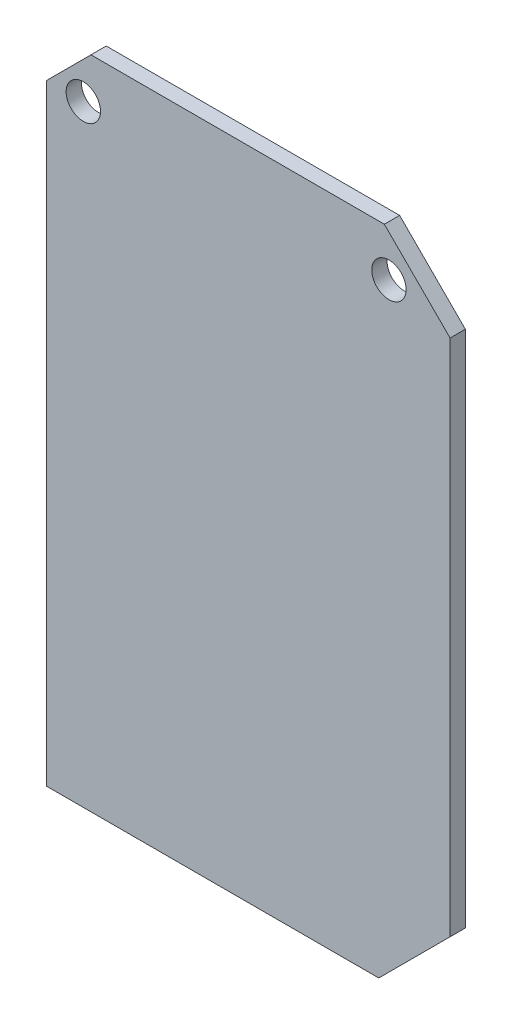
ISO-10303-21;
HEADER;
FILE_DESCRIPTION(('STEP AP214'),'2;1');
FILE_NAME('part.step','',(''),(''),'','','');
FILE_SCHEMA(('AUTOMOTIVE_DESIGN { 1 0 10303 214 1 1 1 1 }'));
ENDSEC;
DATA;
#1=APPLICATION_CONTEXT('core data for automotive mechanical design processes');
#2=APPLICATION_PROTOCOL_DEFINITION('international standard','automotive_design',2000,#1);
#3=PRODUCT_CONTEXT('',#1,'mechanical');
#4=PRODUCT('Part','Part','',(#3));
#5=PRODUCT_RELATED_PRODUCT_CATEGORY('part','',(#4));
#6=PRODUCT_DEFINITION_FORMATION('','',#4);
#7=PRODUCT_DEFINITION_CONTEXT('part definition',#1,'design');
#8=PRODUCT_DEFINITION('design','',#6,#7);
#9=PRODUCT_DEFINITION_SHAPE('','',#8);
#10=(LENGTH_UNIT() NAMED_UNIT(*) SI_UNIT(.MILLI.,.METRE.));
#11=(NAMED_UNIT(*) PLANE_ANGLE_UNIT() SI_UNIT($,.RADIAN.));
#12=(NAMED_UNIT(*) SI_UNIT($,.STERADIAN.) SOLID_ANGLE_UNIT());
#13=UNCERTAINTY_MEASURE_WITH_UNIT(LENGTH_MEASURE(1.E-05),#10,'distance_accuracy_value','');
#14=(GEOMETRIC_REPRESENTATION_CONTEXT(3) GLOBAL_UNCERTAINTY_ASSIGNED_CONTEXT((#13)) GLOBAL_UNIT_ASSIGNED_CONTEXT((#10,
#11,#12)) REPRESENTATION_CONTEXT('',''));
#15=CARTESIAN_POINT('',(0.,0.,0.));
#16=DIRECTION('',(0.,0.,1.));
#17=DIRECTION('',(1.,0.,0.));
#18=AXIS2_PLACEMENT_3D('',#15,#16,#17);
#19=CARTESIAN_POINT('',(4.868530469244,-3.958623226943,26.298881449435));
#20=DIRECTION('',(0.,0.,-1.));
#21=DIRECTION('',(0.,1.,0.));
#22=AXIS2_PLACEMENT_3D('',#19,#20,#21);
#23=PLANE('',#22);
#24=DIRECTION('',(-0.707106781186548,-0.707106781186548,0.));
#25=VECTOR('',#24,1.);
#26=CARTESIAN_POINT('',(31.268530469244,0.708281528888,26.298881449435));
#27=LINE('',#26,#25);
#28=CARTESIAN_POINT('',(26.601625713413,-3.958623226943,26.298881449435));
#29=VERTEX_POINT('',#28);
#30=CARTESIAN_POINT('',(31.268530469244,0.708281528888002,26.298881449435));
#31=VERTEX_POINT('',#30);
#32=EDGE_CURVE('E79',#29,#31,#27,.F.);
#33=ORIENTED_EDGE('',*,*,#32,.T.);
#34=DIRECTION('',(0.,-1.,0.));
#35=VECTOR('',#34,1.);
#36=CARTESIAN_POINT('',(31.268530469244,0.708281528888,26.298881449435));
#37=LINE('',#36,#35);
#38=CARTESIAN_POINT('',(31.268530469244,34.641376773057,26.298881449435));
#39=VERTEX_POINT('',#38);
#40=EDGE_CURVE('E109',#31,#39,#37,.F.);
#41=ORIENTED_EDGE('',*,*,#40,.T.);
#42=DIRECTION('',(0.707106781186548,-0.707106781186548,0.));
#43=VECTOR('',#42,1.);
#44=CARTESIAN_POINT('',(31.268530469244,34.641376773057,26.298881449435));
#45=LINE('',#44,#43);
#46=CARTESIAN_POINT('',(26.968530469244,38.941376773057,26.298881449435));
#47=VERTEX_POINT('',#46);
#48=EDGE_CURVE('E117',#39,#47,#45,.F.);
#49=ORIENTED_EDGE('',*,*,#48,.T.);
#50=DIRECTION('',(1.,0.,0.));
#51=VECTOR('',#50,1.);
#52=CARTESIAN_POINT('',(26.968530469244,38.941376773057,26.298881449435));
#53=LINE('',#52,#51);
#54=CARTESIAN_POINT('',(7.768530469244,38.941376773057,26.298881449435));
#55=VERTEX_POINT('',#54);
#56=EDGE_CURVE('E121',#47,#55,#53,.F.);
#57=ORIENTED_EDGE('',*,*,#56,.T.);
#58=DIRECTION('',(0.707106781186548,0.707106781186548,0.));
#59=VECTOR('',#58,1.);
#60=CARTESIAN_POINT('',(7.768530469244,38.941376773057,26.298881449435));
#61=LINE('',#60,#59);
#62=CARTESIAN_POINT('',(4.868530469244,36.041376773057,26.298881449435));
#63=VERTEX_POINT('',#62);
#64=EDGE_CURVE('E125',#55,#63,#61,.F.);
#65=ORIENTED_EDGE('',*,*,#64,.T.);
#66=DIRECTION('',(0.,1.,0.));
#67=VECTOR('',#66,1.);
#68=CARTESIAN_POINT('',(4.868530469244,36.041376773057,26.298881449435));
#69=LINE('',#68,#67);
#70=CARTESIAN_POINT('',(4.868530469244,-3.95862322694301,26.298881449435));
#71=VERTEX_POINT('',#70);
#72=EDGE_CURVE('E74',#63,#71,#69,.F.);
#73=ORIENTED_EDGE('',*,*,#72,.T.);
#74=DIRECTION('',(-1.,0.,0.));
#75=VECTOR('',#74,1.);
#76=CARTESIAN_POINT('',(26.601625713413,-3.958623226943,26.298881449435));
#77=LINE('',#76,#75);
#78=EDGE_CURVE('E76',#71,#29,#77,.F.);
#79=ORIENTED_EDGE('',*,*,#78,.T.);
#80=EDGE_LOOP('',(#33,#41,#49,#57,#65,#73,#79));
#81=FACE_BOUND('',#80,.T.);
#82=CARTESIAN_POINT('',(7.268530469244,36.041376773057,26.298881449435));
#83=DIRECTION('',(0.,0.,1.));
#84=DIRECTION('',(0.,-1.,0.));
#85=AXIS2_PLACEMENT_3D('',#82,#83,#84);
#86=CIRCLE('',#85,1.125);
#87=CARTESIAN_POINT('',(7.268530469244,34.916376773057,26.298881449435));
#88=VERTEX_POINT('',#87);
#89=EDGE_CURVE('E105',#88,#88,#86,.F.);
#90=ORIENTED_EDGE('',*,*,#89,.T.);
#91=EDGE_LOOP('',(#90));
#92=FACE_BOUND('',#91,.T.);
#93=CARTESIAN_POINT('',(27.268530469244,35.941376773057,26.298881449435));
#94=DIRECTION('',(0.,0.,1.));
#95=DIRECTION('',(0.,-1.,0.));
#96=AXIS2_PLACEMENT_3D('',#93,#94,#95);
#97=CIRCLE('',#96,1.125);
#98=CARTESIAN_POINT('',(27.268530469244,34.816376773057,26.298881449435));
#99=VERTEX_POINT('',#98);
#100=EDGE_CURVE('E20',#99,#99,#97,.F.);
#101=ORIENTED_EDGE('',*,*,#100,.T.);
#102=EDGE_LOOP('',(#101));
#103=FACE_BOUND('',#102,.T.);
#104=ADVANCED_FACE('F17',(#81,#92,#103),#23,.F.);
#105=CARTESIAN_POINT('',(27.268530469244,35.941376773057,25.298881449435));
#106=DIRECTION('',(0.,0.,1.));
#107=DIRECTION('',(0.,-1.,0.));
#108=AXIS2_PLACEMENT_3D('',#105,#106,#107);
#109=CYLINDRICAL_SURFACE('',#108,1.125);
#110=ORIENTED_EDGE('',*,*,#100,.F.);
#111=EDGE_LOOP('',(#110));
#112=FACE_BOUND('',#111,.T.);
#113=CARTESIAN_POINT('',(27.268530469244,35.941376773057,25.298881449435));
#114=DIRECTION('',(0.,0.,1.));
#115=DIRECTION('',(0.,-1.,0.));
#116=AXIS2_PLACEMENT_3D('',#113,#114,#115);
#117=CIRCLE('',#116,1.125);
#118=CARTESIAN_POINT('',(27.268530469244,34.816376773057,25.298881449435));
#119=VERTEX_POINT('',#118);
#120=EDGE_CURVE('E102',#119,#119,#117,.T.);
#121=ORIENTED_EDGE('',*,*,#120,.F.);
#122=EDGE_LOOP('',(#121));
#123=FACE_BOUND('',#122,.T.);
#124=ADVANCED_FACE('F239',(#112,#123),#109,.F.);
#125=CARTESIAN_POINT('',(31.268530469244,0.708281528888,25.298881449435));
#126=DIRECTION('',(-0.707106781186548,0.707106781186548,0.));
#127=DIRECTION('',(-0.707106781186548,-0.707106781186548,0.));
#128=AXIS2_PLACEMENT_3D('',#125,#126,#127);
#129=PLANE('',#128);
#130=DIRECTION('',(-0.707106781186548,-0.707106781186547,0.));
#131=VECTOR('',#130,1.);
#132=CARTESIAN_POINT('',(31.268530469244,0.708281528887999,25.298881449435));
#133=LINE('',#132,#131);
#134=CARTESIAN_POINT('',(31.268530469244,0.708281528888001,25.298881449435));
#135=VERTEX_POINT('',#134);
#136=CARTESIAN_POINT('',(26.601625713413,-3.958623226943,25.298881449435));
#137=VERTEX_POINT('',#136);
#138=EDGE_CURVE('E104',#135,#137,#133,.T.);
#139=ORIENTED_EDGE('',*,*,#138,.F.);
#140=DIRECTION('',(0.,0.,1.));
#141=VECTOR('',#140,1.);
#142=CARTESIAN_POINT('',(31.268530469244,0.708281528887999,25.298881449435));
#143=LINE('',#142,#141);
#144=EDGE_CURVE('E90',#135,#31,#143,.T.);
#145=ORIENTED_EDGE('',*,*,#144,.T.);
#146=ORIENTED_EDGE('',*,*,#32,.F.);
#147=DIRECTION('',(0.,0.,1.));
#148=VECTOR('',#147,1.);
#149=CARTESIAN_POINT('',(26.601625713413,-3.958623226943,25.298881449435));
#150=LINE('',#149,#148);
#151=EDGE_CURVE('E84',#29,#137,#150,.F.);
#152=ORIENTED_EDGE('',*,*,#151,.T.);
#153=EDGE_LOOP('',(#139,#145,#146,#152));
#154=FACE_BOUND('',#153,.T.);
#155=ADVANCED_FACE('F87',(#154),#129,.F.);
#156=CARTESIAN_POINT('',(26.601625713413,-3.958623226943,25.298881449435));
#157=DIRECTION('',(0.,1.,0.));
#158=DIRECTION('',(-1.,0.,0.));
#159=AXIS2_PLACEMENT_3D('',#156,#157,#158);
#160=PLANE('',#159);
#161=DIRECTION('',(1.,0.,0.));
#162=VECTOR('',#161,1.);
#163=CARTESIAN_POINT('',(4.868530469244,-3.958623226943,25.298881449435));
#164=LINE('',#163,#162);
#165=CARTESIAN_POINT('',(4.868530469244,-3.95862322694301,25.298881449435));
#166=VERTEX_POINT('',#165);
#167=EDGE_CURVE('E95',#137,#166,#164,.F.);
#168=ORIENTED_EDGE('',*,*,#167,.F.);
#169=ORIENTED_EDGE('',*,*,#151,.F.);
#170=ORIENTED_EDGE('',*,*,#78,.F.);
#171=DIRECTION('',(0.,0.,1.));
#172=VECTOR('',#171,1.);
#173=CARTESIAN_POINT('',(4.868530469244,-3.95862322694301,25.298881449435));
#174=LINE('',#173,#172);
#175=EDGE_CURVE('E98',#71,#166,#174,.F.);
#176=ORIENTED_EDGE('',*,*,#175,.T.);
#177=EDGE_LOOP('',(#168,#169,#170,#176));
#178=FACE_BOUND('',#177,.T.);
#179=ADVANCED_FACE('F93',(#178),#160,.F.);
#180=CARTESIAN_POINT('',(4.868530469244,36.041376773057,25.298881449435));
#181=DIRECTION('',(1.,0.,0.));
#182=DIRECTION('',(0.,1.,0.));
#183=AXIS2_PLACEMENT_3D('',#180,#181,#182);
#184=PLANE('',#183);
#185=DIRECTION('',(0.,1.,0.));
#186=VECTOR('',#185,1.);
#187=CARTESIAN_POINT('',(4.868530469244,-3.958623226943,25.298881449435));
#188=LINE('',#187,#186);
#189=CARTESIAN_POINT('',(4.868530469244,36.041376773057,25.298881449435));
#190=VERTEX_POINT('',#189);
#191=EDGE_CURVE('E129',#166,#190,#188,.T.);
#192=ORIENTED_EDGE('',*,*,#191,.F.);
#193=ORIENTED_EDGE('',*,*,#175,.F.);
#194=ORIENTED_EDGE('',*,*,#72,.F.);
#195=DIRECTION('',(0.,0.,1.));
#196=VECTOR('',#195,1.);
#197=CARTESIAN_POINT('',(4.868530469244,36.041376773057,25.298881449435));
#198=LINE('',#197,#196);
#199=EDGE_CURVE('E123',#63,#190,#198,.F.);
#200=ORIENTED_EDGE('',*,*,#199,.T.);
#201=EDGE_LOOP('',(#192,#193,#194,#200));
#202=FACE_BOUND('',#201,.T.);
#203=ADVANCED_FACE('F130',(#202),#184,.F.);
#204=CARTESIAN_POINT('',(7.768530469244,38.941376773057,25.298881449435));
#205=DIRECTION('',(0.707106781186548,-0.707106781186548,0.));
#206=DIRECTION('',(0.707106781186548,0.707106781186548,0.));
#207=AXIS2_PLACEMENT_3D('',#204,#205,#206);
#208=PLANE('',#207);
#209=DIRECTION('',(0.707106781186547,0.707106781186548,0.));
#210=VECTOR('',#209,1.);
#211=CARTESIAN_POINT('',(4.868530469244,36.041376773057,25.298881449435));
#212=LINE('',#211,#210);
#213=CARTESIAN_POINT('',(7.768530469244,38.941376773057,25.298881449435));
#214=VERTEX_POINT('',#213);
#215=EDGE_CURVE('E135',#190,#214,#212,.T.);
#216=ORIENTED_EDGE('',*,*,#215,.F.);
#217=ORIENTED_EDGE('',*,*,#199,.F.);
#218=ORIENTED_EDGE('',*,*,#64,.F.);
#219=DIRECTION('',(0.,0.,-1.));
#220=VECTOR('',#219,1.);
#221=CARTESIAN_POINT('',(7.768530469244,38.941376773057,25.298881449435));
#222=LINE('',#221,#220);
#223=EDGE_CURVE('E119',#55,#214,#222,.T.);
#224=ORIENTED_EDGE('',*,*,#223,.T.);
#225=EDGE_LOOP('',(#216,#217,#218,#224));
#226=FACE_BOUND('',#225,.T.);
#227=ADVANCED_FACE('F159',(#226),#208,.F.);
#228=CARTESIAN_POINT('',(26.968530469244,38.941376773057,25.298881449435));
#229=DIRECTION('',(0.,-1.,0.));
#230=DIRECTION('',(0.,0.,-1.));
#231=AXIS2_PLACEMENT_3D('',#228,#229,#230);
#232=PLANE('',#231);
#233=DIRECTION('',(1.,0.,0.));
#234=VECTOR('',#233,1.);
#235=CARTESIAN_POINT('',(4.868530469244,38.941376773057,25.298881449435));
#236=LINE('',#235,#234);
#237=CARTESIAN_POINT('',(26.968530469244,38.941376773057,25.298881449435));
#238=VERTEX_POINT('',#237);
#239=EDGE_CURVE('E143',#214,#238,#236,.T.);
#240=ORIENTED_EDGE('',*,*,#239,.F.);
#241=ORIENTED_EDGE('',*,*,#223,.F.);
#242=ORIENTED_EDGE('',*,*,#56,.F.);
#243=DIRECTION('',(0.,0.,1.));
#244=VECTOR('',#243,1.);
#245=CARTESIAN_POINT('',(26.968530469244,38.941376773057,25.298881449435));
#246=LINE('',#245,#244);
#247=EDGE_CURVE('E115',#47,#238,#246,.F.);
#248=ORIENTED_EDGE('',*,*,#247,.T.);
#249=EDGE_LOOP('',(#240,#241,#242,#248));
#250=FACE_BOUND('',#249,.T.);
#251=ADVANCED_FACE('F155',(#250),#232,.F.);
#252=CARTESIAN_POINT('',(31.268530469244,34.641376773057,25.298881449435));
#253=DIRECTION('',(-0.707106781186548,-0.707106781186548,0.));
#254=DIRECTION('',(0.707106781186548,-0.707106781186548,0.));
#255=AXIS2_PLACEMENT_3D('',#252,#253,#254);
#256=PLANE('',#255);
#257=DIRECTION('',(0.707106781186547,-0.707106781186547,0.));
#258=VECTOR('',#257,1.);
#259=CARTESIAN_POINT('',(26.968530469244,38.941376773057,25.298881449435));
#260=LINE('',#259,#258);
#261=CARTESIAN_POINT('',(31.268530469244,34.641376773057,25.298881449435));
#262=VERTEX_POINT('',#261);
#263=EDGE_CURVE('E146',#238,#262,#260,.T.);
#264=ORIENTED_EDGE('',*,*,#263,.F.);
#265=ORIENTED_EDGE('',*,*,#247,.F.);
#266=ORIENTED_EDGE('',*,*,#48,.F.);
#267=DIRECTION('',(0.,0.,1.));
#268=VECTOR('',#267,1.);
#269=CARTESIAN_POINT('',(31.268530469244,34.641376773057,25.298881449435));
#270=LINE('',#269,#268);
#271=EDGE_CURVE('E35',#39,#262,#270,.F.);
#272=ORIENTED_EDGE('',*,*,#271,.T.);
#273=EDGE_LOOP('',(#264,#265,#266,#272));
#274=FACE_BOUND('',#273,.T.);
#275=ADVANCED_FACE('F152',(#274),#256,.F.);
#276=CARTESIAN_POINT('',(31.268530469244,0.708281528888,25.298881449435));
#277=DIRECTION('',(-1.,0.,0.));
#278=DIRECTION('',(0.,-1.,0.));
#279=AXIS2_PLACEMENT_3D('',#276,#277,#278);
#280=PLANE('',#279);
#281=DIRECTION('',(0.,1.,0.));
#282=VECTOR('',#281,1.);
#283=CARTESIAN_POINT('',(31.268530469244,-3.958623226943,25.298881449435));
#284=LINE('',#283,#282);
#285=EDGE_CURVE('E26',#262,#135,#284,.F.);
#286=ORIENTED_EDGE('',*,*,#285,.F.);
#287=ORIENTED_EDGE('',*,*,#271,.F.);
#288=ORIENTED_EDGE('',*,*,#40,.F.);
#289=ORIENTED_EDGE('',*,*,#144,.F.);
#290=EDGE_LOOP('',(#286,#287,#288,#289));
#291=FACE_BOUND('',#290,.T.);
#292=ADVANCED_FACE('F149',(#291),#280,.F.);
#293=CARTESIAN_POINT('',(7.268530469244,36.041376773057,25.298881449435));
#294=DIRECTION('',(0.,0.,1.));
#295=DIRECTION('',(0.,-1.,0.));
#296=AXIS2_PLACEMENT_3D('',#293,#294,#295);
#297=CYLINDRICAL_SURFACE('',#296,1.125);
#298=ORIENTED_EDGE('',*,*,#89,.F.);
#299=EDGE_LOOP('',(#298));
#300=FACE_BOUND('',#299,.T.);
#301=CARTESIAN_POINT('',(7.268530469244,36.041376773057,25.298881449435));
#302=DIRECTION('',(0.,0.,1.));
#303=DIRECTION('',(0.,-1.,0.));
#304=AXIS2_PLACEMENT_3D('',#301,#302,#303);
#305=CIRCLE('',#304,1.125);
#306=CARTESIAN_POINT('',(7.268530469244,34.916376773057,25.298881449435));
#307=VERTEX_POINT('',#306);
#308=EDGE_CURVE('E11',#307,#307,#305,.T.);
#309=ORIENTED_EDGE('',*,*,#308,.F.);
#310=EDGE_LOOP('',(#309));
#311=FACE_BOUND('',#310,.T.);
#312=ADVANCED_FACE('F170',(#300,#311),#297,.F.);
#313=CARTESIAN_POINT('',(4.868530469244,-3.958623226943,25.298881449435));
#314=DIRECTION('',(0.,0.,-1.));
#315=DIRECTION('',(0.,1.,0.));
#316=AXIS2_PLACEMENT_3D('',#313,#314,#315);
#317=PLANE('',#316);
#318=ORIENTED_EDGE('',*,*,#308,.T.);
#319=EDGE_LOOP('',(#318));
#320=FACE_BOUND('',#319,.T.);
#321=ORIENTED_EDGE('',*,*,#263,.T.);
#322=ORIENTED_EDGE('',*,*,#285,.T.);
#323=ORIENTED_EDGE('',*,*,#138,.T.);
#324=ORIENTED_EDGE('',*,*,#167,.T.);
#325=ORIENTED_EDGE('',*,*,#191,.T.);
#326=ORIENTED_EDGE('',*,*,#215,.T.);
#327=ORIENTED_EDGE('',*,*,#239,.T.);
#328=EDGE_LOOP('',(#321,#322,#323,#324,#325,#326,#327));
#329=FACE_BOUND('',#328,.T.);
#330=ORIENTED_EDGE('',*,*,#120,.T.);
#331=EDGE_LOOP('',(#330));
#332=FACE_BOUND('',#331,.T.);
#333=ADVANCED_FACE('F138',(#320,#329,#332),#317,.T.);
#334=CLOSED_SHELL('',(#104,#124,#155,#179,#203,#227,#251,#275,#292,#312,#333));
#335=MANIFOLD_SOLID_BREP('B1',#334);
#336=ADVANCED_BREP_SHAPE_REPRESENTATION('',(#18,#335),#14);
#337=SHAPE_DEFINITION_REPRESENTATION(#9,#336);
ENDSEC;
END-ISO-10303-21;
